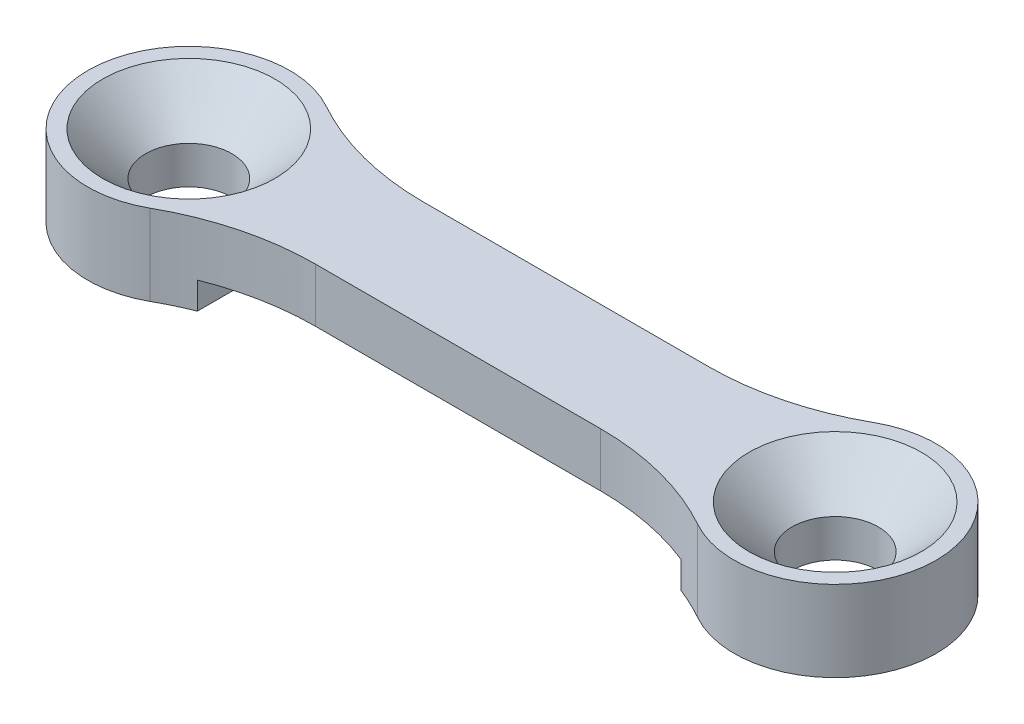
ISO-10303-21;
HEADER;
FILE_DESCRIPTION(('STEP AP214'),'2;1');
FILE_NAME('part.step','',(''),(''),'','','');
FILE_SCHEMA(('AUTOMOTIVE_DESIGN { 1 0 10303 214 1 1 1 1 }'));
ENDSEC;
DATA;
#1=APPLICATION_CONTEXT('core data for automotive mechanical design processes');
#2=APPLICATION_PROTOCOL_DEFINITION('international standard','automotive_design',2000,#1);
#3=PRODUCT_CONTEXT('',#1,'mechanical');
#4=PRODUCT('Part','Part','',(#3));
#5=PRODUCT_RELATED_PRODUCT_CATEGORY('part','',(#4));
#6=PRODUCT_DEFINITION_FORMATION('','',#4);
#7=PRODUCT_DEFINITION_CONTEXT('part definition',#1,'design');
#8=PRODUCT_DEFINITION('design','',#6,#7);
#9=PRODUCT_DEFINITION_SHAPE('','',#8);
#10=(LENGTH_UNIT() NAMED_UNIT(*) SI_UNIT(.MILLI.,.METRE.));
#11=(NAMED_UNIT(*) PLANE_ANGLE_UNIT() SI_UNIT($,.RADIAN.));
#12=(NAMED_UNIT(*) SI_UNIT($,.STERADIAN.) SOLID_ANGLE_UNIT());
#13=UNCERTAINTY_MEASURE_WITH_UNIT(LENGTH_MEASURE(1.E-05),#10,'distance_accuracy_value','');
#14=(GEOMETRIC_REPRESENTATION_CONTEXT(3) GLOBAL_UNCERTAINTY_ASSIGNED_CONTEXT((#13)) GLOBAL_UNIT_ASSIGNED_CONTEXT((#10,
#11,#12)) REPRESENTATION_CONTEXT('',''));
#15=CARTESIAN_POINT('',(0.,0.,0.));
#16=DIRECTION('',(0.,0.,1.));
#17=DIRECTION('',(1.,0.,0.));
#18=AXIS2_PLACEMENT_3D('',#15,#16,#17);
#19=CARTESIAN_POINT('',(0.,3.,2.00000000000001));
#20=DIRECTION('',(0.,0.,-1.));
#21=DIRECTION('',(-1.,0.,0.));
#22=AXIS2_PLACEMENT_3D('',#19,#20,#21);
#23=PLANE('',#22);
#24=DIRECTION('',(-1.,0.,0.));
#25=VECTOR('',#24,1.);
#26=CARTESIAN_POINT('',(0.,1.,2.00000000000001));
#27=LINE('',#26,#25);
#28=CARTESIAN_POINT('',(5.28713920895123,1.,2.));
#29=VERTEX_POINT('',#28);
#30=CARTESIAN_POINT('',(-5.28713920895124,1.,2.00000000000001));
#31=VERTEX_POINT('',#30);
#32=EDGE_CURVE('E66',#29,#31,#27,.T.);
#33=ORIENTED_EDGE('',*,*,#32,.F.);
#34=DIRECTION('',(0.,1.,0.));
#35=VECTOR('',#34,1.);
#36=CARTESIAN_POINT('',(5.28713920895123,3.,2.));
#37=LINE('',#36,#35);
#38=CARTESIAN_POINT('',(5.28713920895123,3.,2.));
#39=VERTEX_POINT('',#38);
#40=EDGE_CURVE('E236',#29,#39,#37,.T.);
#41=ORIENTED_EDGE('',*,*,#40,.T.);
#42=DIRECTION('',(1.,0.,0.));
#43=VECTOR('',#42,1.);
#44=CARTESIAN_POINT('',(0.,3.,2.00000000000001));
#45=LINE('',#44,#43);
#46=CARTESIAN_POINT('',(-5.28713920895124,3.,2.00000000000001));
#47=VERTEX_POINT('',#46);
#48=EDGE_CURVE('E183',#47,#39,#45,.T.);
#49=ORIENTED_EDGE('',*,*,#48,.F.);
#50=DIRECTION('',(0.,1.,0.));
#51=VECTOR('',#50,1.);
#52=CARTESIAN_POINT('',(-5.28713920895124,0.,2.00000000000001));
#53=LINE('',#52,#51);
#54=EDGE_CURVE('E232',#47,#31,#53,.F.);
#55=ORIENTED_EDGE('',*,*,#54,.T.);
#56=EDGE_LOOP('',(#33,#41,#49,#55));
#57=FACE_BOUND('',#56,.T.);
#58=ADVANCED_FACE('F51',(#57),#23,.F.);
#59=CARTESIAN_POINT('',(0.,3.,-2.));
#60=DIRECTION('',(0.,0.,-1.));
#61=DIRECTION('',(-1.,0.,0.));
#62=AXIS2_PLACEMENT_3D('',#59,#60,#61);
#63=PLANE('',#62);
#64=DIRECTION('',(0.,-1.,0.));
#65=VECTOR('',#64,1.);
#66=CARTESIAN_POINT('',(5.28713920895123,3.,-2.));
#67=LINE('',#66,#65);
#68=CARTESIAN_POINT('',(5.28713920895123,3.,-2.));
#69=VERTEX_POINT('',#68);
#70=CARTESIAN_POINT('',(5.28713920895123,1.,-2.));
#71=VERTEX_POINT('',#70);
#72=EDGE_CURVE('E241',#69,#71,#67,.T.);
#73=ORIENTED_EDGE('',*,*,#72,.T.);
#74=DIRECTION('',(-1.,0.,0.));
#75=VECTOR('',#74,1.);
#76=CARTESIAN_POINT('',(0.,1.,-2.));
#77=LINE('',#76,#75);
#78=CARTESIAN_POINT('',(-5.28713920895122,1.,-2.));
#79=VERTEX_POINT('',#78);
#80=EDGE_CURVE('E167',#71,#79,#77,.T.);
#81=ORIENTED_EDGE('',*,*,#80,.T.);
#82=DIRECTION('',(0.,-1.,0.));
#83=VECTOR('',#82,1.);
#84=CARTESIAN_POINT('',(-5.28713920895122,3.,-2.));
#85=LINE('',#84,#83);
#86=CARTESIAN_POINT('',(-5.28713920895122,3.,-2.));
#87=VERTEX_POINT('',#86);
#88=EDGE_CURVE('E165',#79,#87,#85,.F.);
#89=ORIENTED_EDGE('',*,*,#88,.T.);
#90=DIRECTION('',(1.,0.,0.));
#91=VECTOR('',#90,1.);
#92=CARTESIAN_POINT('',(0.,3.,-2.));
#93=LINE('',#92,#91);
#94=EDGE_CURVE('E192',#87,#69,#93,.T.);
#95=ORIENTED_EDGE('',*,*,#94,.T.);
#96=EDGE_LOOP('',(#73,#81,#89,#95));
#97=FACE_BOUND('',#96,.T.);
#98=ADVANCED_FACE('F325',(#97),#63,.T.);
#99=CARTESIAN_POINT('',(0.,0.,0.));
#100=DIRECTION('',(0.,1.,0.));
#101=DIRECTION('',(0.,0.,1.));
#102=AXIS2_PLACEMENT_3D('',#99,#100,#101);
#103=PLANE('',#102);
#104=CARTESIAN_POINT('',(-12.,0.,0.));
#105=DIRECTION('',(0.,1.,0.));
#106=DIRECTION('',(0.,0.,1.));
#107=AXIS2_PLACEMENT_3D('',#104,#105,#106);
#108=CIRCLE('',#107,1.6);
#109=CARTESIAN_POINT('',(-12.,0.,1.6));
#110=VERTEX_POINT('',#109);
#111=EDGE_CURVE('E179',#110,#110,#108,.T.);
#112=ORIENTED_EDGE('',*,*,#111,.T.);
#113=EDGE_LOOP('',(#112));
#114=FACE_BOUND('',#113,.T.);
#115=CARTESIAN_POINT('',(-5.28713920895122,0.,-12.));
#116=DIRECTION('',(0.,1.,0.));
#117=DIRECTION('',(0.,0.,1.));
#118=AXIS2_PLACEMENT_3D('',#115,#116,#117);
#119=CIRCLE('',#118,10.);
#120=CARTESIAN_POINT('',(-10.1692197842594,0.,-3.27272727272727));
#121=VERTEX_POINT('',#120);
#122=CARTESIAN_POINT('',(-8.975,0.,-2.70485703252257));
#123=VERTEX_POINT('',#122);
#124=EDGE_CURVE('E264',#121,#123,#119,.T.);
#125=ORIENTED_EDGE('',*,*,#124,.T.);
#126=DIRECTION('',(0.,0.,-1.));
#127=VECTOR('',#126,1.);
#128=CARTESIAN_POINT('',(-8.975,0.,-2.70485703252257));
#129=LINE('',#128,#127);
#130=CARTESIAN_POINT('',(-8.975,0.,2.70485703252257));
#131=VERTEX_POINT('',#130);
#132=EDGE_CURVE('E148',#131,#123,#129,.T.);
#133=ORIENTED_EDGE('',*,*,#132,.F.);
#134=CARTESIAN_POINT('',(-5.28713920895124,0.,12.));
#135=DIRECTION('',(0.,1.,0.));
#136=DIRECTION('',(0.,0.,1.));
#137=AXIS2_PLACEMENT_3D('',#134,#135,#136);
#138=CIRCLE('',#137,10.);
#139=CARTESIAN_POINT('',(-10.1692197842594,0.,3.27272727272727));
#140=VERTEX_POINT('',#139);
#141=EDGE_CURVE('E270',#131,#140,#138,.T.);
#142=ORIENTED_EDGE('',*,*,#141,.T.);
#143=CARTESIAN_POINT('',(-12.,0.,0.));
#144=DIRECTION('',(0.,1.,0.));
#145=DIRECTION('',(0.,0.,1.));
#146=AXIS2_PLACEMENT_3D('',#143,#144,#145);
#147=CIRCLE('',#146,3.75);
#148=EDGE_CURVE('E200',#121,#140,#147,.T.);
#149=ORIENTED_EDGE('',*,*,#148,.F.);
#150=EDGE_LOOP('',(#125,#133,#142,#149));
#151=FACE_BOUND('',#150,.T.);
#152=ADVANCED_FACE('F330',(#114,#151),#103,.F.);
#153=CARTESIAN_POINT('',(-12.,3.,0.));
#154=DIRECTION('',(0.,-1.,0.));
#155=DIRECTION('',(0.,0.,-1.));
#156=AXIS2_PLACEMENT_3D('',#153,#154,#155);
#157=CYLINDRICAL_SURFACE('',#156,3.75);
#158=CARTESIAN_POINT('',(-12.,3.,0.));
#159=DIRECTION('',(0.,1.,0.));
#160=DIRECTION('',(0.,0.,1.));
#161=AXIS2_PLACEMENT_3D('',#158,#159,#160);
#162=CIRCLE('',#161,3.75);
#163=CARTESIAN_POINT('',(-10.1692197842594,3.,-3.27272727272727));
#164=VERTEX_POINT('',#163);
#165=CARTESIAN_POINT('',(-10.1692197842594,3.,3.27272727272727));
#166=VERTEX_POINT('',#165);
#167=EDGE_CURVE('E180',#164,#166,#162,.T.);
#168=ORIENTED_EDGE('',*,*,#167,.F.);
#169=DIRECTION('',(0.,-1.,0.));
#170=VECTOR('',#169,1.);
#171=CARTESIAN_POINT('',(-10.1692197842594,3.,-3.27272727272727));
#172=LINE('',#171,#170);
#173=EDGE_CURVE('E247',#164,#121,#172,.T.);
#174=ORIENTED_EDGE('',*,*,#173,.T.);
#175=ORIENTED_EDGE('',*,*,#148,.T.);
#176=DIRECTION('',(0.,-1.,0.));
#177=VECTOR('',#176,1.);
#178=CARTESIAN_POINT('',(-10.1692197842594,3.,3.27272727272727));
#179=LINE('',#178,#177);
#180=EDGE_CURVE('E74',#140,#166,#179,.F.);
#181=ORIENTED_EDGE('',*,*,#180,.T.);
#182=EDGE_LOOP('',(#168,#174,#175,#181));
#183=FACE_BOUND('',#182,.T.);
#184=ADVANCED_FACE('F328',(#183),#157,.T.);
#185=CARTESIAN_POINT('',(12.,3.,0.));
#186=DIRECTION('',(0.,-1.,0.));
#187=DIRECTION('',(0.,0.,-1.));
#188=AXIS2_PLACEMENT_3D('',#185,#186,#187);
#189=CYLINDRICAL_SURFACE('',#188,3.75);
#190=CARTESIAN_POINT('',(12.,3.,0.));
#191=DIRECTION('',(0.,1.,0.));
#192=DIRECTION('',(0.,0.,1.));
#193=AXIS2_PLACEMENT_3D('',#190,#191,#192);
#194=CIRCLE('',#193,3.75);
#195=CARTESIAN_POINT('',(10.1692197842594,3.,3.27272727272727));
#196=VERTEX_POINT('',#195);
#197=CARTESIAN_POINT('',(10.1692197842594,3.,-3.27272727272727));
#198=VERTEX_POINT('',#197);
#199=EDGE_CURVE('E188',#196,#198,#194,.T.);
#200=ORIENTED_EDGE('',*,*,#199,.F.);
#201=DIRECTION('',(0.,-1.,0.));
#202=VECTOR('',#201,1.);
#203=CARTESIAN_POINT('',(10.1692197842594,3.,3.27272727272727));
#204=LINE('',#203,#202);
#205=CARTESIAN_POINT('',(10.1692197842594,0.,3.27272727272727));
#206=VERTEX_POINT('',#205);
#207=EDGE_CURVE('E228',#196,#206,#204,.T.);
#208=ORIENTED_EDGE('',*,*,#207,.T.);
#209=CARTESIAN_POINT('',(12.,0.,0.));
#210=DIRECTION('',(0.,1.,0.));
#211=DIRECTION('',(0.,0.,1.));
#212=AXIS2_PLACEMENT_3D('',#209,#210,#211);
#213=CIRCLE('',#212,3.75);
#214=CARTESIAN_POINT('',(10.1692197842594,0.,-3.27272727272727));
#215=VERTEX_POINT('',#214);
#216=EDGE_CURVE('E203',#206,#215,#213,.T.);
#217=ORIENTED_EDGE('',*,*,#216,.T.);
#218=DIRECTION('',(0.,-1.,0.));
#219=VECTOR('',#218,1.);
#220=CARTESIAN_POINT('',(10.1692197842594,3.,-3.27272727272727));
#221=LINE('',#220,#219);
#222=EDGE_CURVE('E225',#215,#198,#221,.F.);
#223=ORIENTED_EDGE('',*,*,#222,.T.);
#224=EDGE_LOOP('',(#200,#208,#217,#223));
#225=FACE_BOUND('',#224,.T.);
#226=ADVANCED_FACE('F316',(#225),#189,.T.);
#227=CARTESIAN_POINT('',(-12.,3.,0.));
#228=DIRECTION('',(0.,-1.,0.));
#229=DIRECTION('',(0.,0.,-1.));
#230=AXIS2_PLACEMENT_3D('',#227,#228,#229);
#231=CYLINDRICAL_SURFACE('',#230,1.6);
#232=CARTESIAN_POINT('',(-12.,1.4,0.));
#233=DIRECTION('',(0.,1.,0.));
#234=DIRECTION('',(0.,0.,1.));
#235=AXIS2_PLACEMENT_3D('',#232,#233,#234);
#236=CIRCLE('',#235,1.6);
#237=CARTESIAN_POINT('',(-12.,1.4,1.6));
#238=VERTEX_POINT('',#237);
#239=EDGE_CURVE('E221',#238,#238,#236,.T.);
#240=ORIENTED_EDGE('',*,*,#239,.T.);
#241=EDGE_LOOP('',(#240));
#242=FACE_BOUND('',#241,.T.);
#243=ORIENTED_EDGE('',*,*,#111,.F.);
#244=EDGE_LOOP('',(#243));
#245=FACE_BOUND('',#244,.T.);
#246=ADVANCED_FACE('F351',(#242,#245),#231,.F.);
#247=CARTESIAN_POINT('',(12.,3.,0.));
#248=DIRECTION('',(0.,-1.,0.));
#249=DIRECTION('',(0.,0.,-1.));
#250=AXIS2_PLACEMENT_3D('',#247,#248,#249);
#251=CYLINDRICAL_SURFACE('',#250,1.6);
#252=CARTESIAN_POINT('',(12.,1.4,0.));
#253=DIRECTION('',(0.,1.,0.));
#254=DIRECTION('',(0.,0.,1.));
#255=AXIS2_PLACEMENT_3D('',#252,#253,#254);
#256=CIRCLE('',#255,1.6);
#257=CARTESIAN_POINT('',(12.,1.4,1.6));
#258=VERTEX_POINT('',#257);
#259=EDGE_CURVE('E196',#258,#258,#256,.T.);
#260=ORIENTED_EDGE('',*,*,#259,.T.);
#261=EDGE_LOOP('',(#260));
#262=FACE_BOUND('',#261,.T.);
#263=CARTESIAN_POINT('',(12.,0.,0.));
#264=DIRECTION('',(0.,1.,0.));
#265=DIRECTION('',(0.,0.,1.));
#266=AXIS2_PLACEMENT_3D('',#263,#264,#265);
#267=CIRCLE('',#266,1.6);
#268=CARTESIAN_POINT('',(12.,0.,1.6));
#269=VERTEX_POINT('',#268);
#270=EDGE_CURVE('E184',#269,#269,#267,.T.);
#271=ORIENTED_EDGE('',*,*,#270,.F.);
#272=EDGE_LOOP('',(#271));
#273=FACE_BOUND('',#272,.T.);
#274=ADVANCED_FACE('F354',(#262,#273),#251,.F.);
#275=CARTESIAN_POINT('',(0.,3.,0.));
#276=DIRECTION('',(0.,1.,0.));
#277=DIRECTION('',(0.,0.,1.));
#278=AXIS2_PLACEMENT_3D('',#275,#276,#277);
#279=PLANE('',#278);
#280=CARTESIAN_POINT('',(12.,3.,0.));
#281=DIRECTION('',(0.,1.,0.));
#282=DIRECTION('',(0.,0.,1.));
#283=AXIS2_PLACEMENT_3D('',#280,#281,#282);
#284=CIRCLE('',#283,3.20000000000001);
#285=CARTESIAN_POINT('',(12.,3.,3.20000000000001));
#286=VERTEX_POINT('',#285);
#287=EDGE_CURVE('E217',#286,#286,#284,.F.);
#288=ORIENTED_EDGE('',*,*,#287,.T.);
#289=EDGE_LOOP('',(#288));
#290=FACE_BOUND('',#289,.T.);
#291=CARTESIAN_POINT('',(-12.,3.,0.));
#292=DIRECTION('',(0.,1.,0.));
#293=DIRECTION('',(0.,0.,1.));
#294=AXIS2_PLACEMENT_3D('',#291,#292,#293);
#295=CIRCLE('',#294,3.20000000000001);
#296=CARTESIAN_POINT('',(-12.,3.,3.20000000000001));
#297=VERTEX_POINT('',#296);
#298=EDGE_CURVE('E213',#297,#297,#295,.F.);
#299=ORIENTED_EDGE('',*,*,#298,.T.);
#300=EDGE_LOOP('',(#299));
#301=FACE_BOUND('',#300,.T.);
#302=ORIENTED_EDGE('',*,*,#94,.F.);
#303=CARTESIAN_POINT('',(-5.28713920895122,3.,-12.));
#304=DIRECTION('',(0.,1.,0.));
#305=DIRECTION('',(0.,0.,1.));
#306=AXIS2_PLACEMENT_3D('',#303,#304,#305);
#307=CIRCLE('',#306,10.);
#308=EDGE_CURVE('E267',#87,#164,#307,.F.);
#309=ORIENTED_EDGE('',*,*,#308,.T.);
#310=ORIENTED_EDGE('',*,*,#167,.T.);
#311=CARTESIAN_POINT('',(-5.28713920895124,3.,12.));
#312=DIRECTION('',(0.,1.,0.));
#313=DIRECTION('',(0.,0.,1.));
#314=AXIS2_PLACEMENT_3D('',#311,#312,#313);
#315=CIRCLE('',#314,10.);
#316=EDGE_CURVE('E60',#166,#47,#315,.F.);
#317=ORIENTED_EDGE('',*,*,#316,.T.);
#318=ORIENTED_EDGE('',*,*,#48,.T.);
#319=CARTESIAN_POINT('',(5.28713920895123,3.,12.));
#320=DIRECTION('',(0.,1.,0.));
#321=DIRECTION('',(0.,0.,1.));
#322=AXIS2_PLACEMENT_3D('',#319,#320,#321);
#323=CIRCLE('',#322,10.);
#324=EDGE_CURVE('E255',#39,#196,#323,.F.);
#325=ORIENTED_EDGE('',*,*,#324,.T.);
#326=ORIENTED_EDGE('',*,*,#199,.T.);
#327=CARTESIAN_POINT('',(5.28713920895123,3.,-12.));
#328=DIRECTION('',(0.,1.,0.));
#329=DIRECTION('',(0.,0.,1.));
#330=AXIS2_PLACEMENT_3D('',#327,#328,#329);
#331=CIRCLE('',#330,10.);
#332=EDGE_CURVE('E261',#198,#69,#331,.F.);
#333=ORIENTED_EDGE('',*,*,#332,.T.);
#334=EDGE_LOOP('',(#302,#309,#310,#317,#318,#325,#326,#333));
#335=FACE_BOUND('',#334,.T.);
#336=ADVANCED_FACE('F277',(#290,#301,#335),#279,.T.);
#337=CARTESIAN_POINT('',(5.28713920895123,0.,12.));
#338=DIRECTION('',(0.,1.,0.));
#339=DIRECTION('',(0.,0.,1.));
#340=AXIS2_PLACEMENT_3D('',#337,#338,#339);
#341=CIRCLE('',#340,10.);
#342=CARTESIAN_POINT('',(8.975,0.,2.70485703252257));
#343=VERTEX_POINT('',#342);
#344=EDGE_CURVE('E251',#206,#343,#341,.T.);
#345=ORIENTED_EDGE('',*,*,#344,.T.);
#346=DIRECTION('',(0.,0.,1.));
#347=VECTOR('',#346,1.);
#348=CARTESIAN_POINT('',(8.975,0.,-2.70485703252257));
#349=LINE('',#348,#347);
#350=CARTESIAN_POINT('',(8.975,0.,-2.70485703252257));
#351=VERTEX_POINT('',#350);
#352=EDGE_CURVE('E160',#351,#343,#349,.T.);
#353=ORIENTED_EDGE('',*,*,#352,.F.);
#354=CARTESIAN_POINT('',(5.28713920895123,0.,-12.));
#355=DIRECTION('',(0.,1.,0.));
#356=DIRECTION('',(0.,0.,1.));
#357=AXIS2_PLACEMENT_3D('',#354,#355,#356);
#358=CIRCLE('',#357,10.);
#359=EDGE_CURVE('E258',#351,#215,#358,.T.);
#360=ORIENTED_EDGE('',*,*,#359,.T.);
#361=ORIENTED_EDGE('',*,*,#216,.F.);
#362=EDGE_LOOP('',(#345,#353,#360,#361));
#363=FACE_BOUND('',#362,.T.);
#364=ORIENTED_EDGE('',*,*,#270,.T.);
#365=EDGE_LOOP('',(#364));
#366=FACE_BOUND('',#365,.T.);
#367=ADVANCED_FACE('F306',(#363,#366),#103,.F.);
#368=CARTESIAN_POINT('',(12.,1.4,0.));
#369=DIRECTION('',(0.,1.,0.));
#370=DIRECTION('',(0.,0.,1.));
#371=AXIS2_PLACEMENT_3D('',#368,#369,#370);
#372=CONICAL_SURFACE('',#371,1.6,0.78539816339745);
#373=ORIENTED_EDGE('',*,*,#287,.F.);
#374=EDGE_LOOP('',(#373));
#375=FACE_BOUND('',#374,.T.);
#376=ORIENTED_EDGE('',*,*,#259,.F.);
#377=EDGE_LOOP('',(#376));
#378=FACE_BOUND('',#377,.T.);
#379=ADVANCED_FACE('F343',(#375,#378),#372,.F.);
#380=CARTESIAN_POINT('',(-12.,1.4,0.));
#381=DIRECTION('',(0.,1.,0.));
#382=DIRECTION('',(0.,0.,1.));
#383=AXIS2_PLACEMENT_3D('',#380,#381,#382);
#384=CONICAL_SURFACE('',#383,1.6,0.78539816339745);
#385=ORIENTED_EDGE('',*,*,#298,.F.);
#386=EDGE_LOOP('',(#385));
#387=FACE_BOUND('',#386,.T.);
#388=ORIENTED_EDGE('',*,*,#239,.F.);
#389=EDGE_LOOP('',(#388));
#390=FACE_BOUND('',#389,.T.);
#391=ADVANCED_FACE('F362',(#387,#390),#384,.F.);
#392=CARTESIAN_POINT('',(5.28713920895123,3.,12.));
#393=DIRECTION('',(0.,-1.,0.));
#394=DIRECTION('',(0.,0.,-1.));
#395=AXIS2_PLACEMENT_3D('',#392,#393,#394);
#396=CYLINDRICAL_SURFACE('',#395,10.);
#397=CARTESIAN_POINT('',(5.28713920895123,1.,12.));
#398=DIRECTION('',(0.,-1.,0.));
#399=DIRECTION('',(0.,0.,-1.));
#400=AXIS2_PLACEMENT_3D('',#397,#398,#399);
#401=CIRCLE('',#400,10.);
#402=CARTESIAN_POINT('',(8.975,1.,2.70485703252257));
#403=VERTEX_POINT('',#402);
#404=EDGE_CURVE('E168',#403,#29,#401,.F.);
#405=ORIENTED_EDGE('',*,*,#404,.F.);
#406=DIRECTION('',(0.,-1.,0.));
#407=VECTOR('',#406,1.);
#408=CARTESIAN_POINT('',(8.975,1.,2.70485703252257));
#409=LINE('',#408,#407);
#410=EDGE_CURVE('E286',#403,#343,#409,.T.);
#411=ORIENTED_EDGE('',*,*,#410,.T.);
#412=ORIENTED_EDGE('',*,*,#344,.F.);
#413=ORIENTED_EDGE('',*,*,#207,.F.);
#414=ORIENTED_EDGE('',*,*,#324,.F.);
#415=ORIENTED_EDGE('',*,*,#40,.F.);
#416=EDGE_LOOP('',(#405,#411,#412,#413,#414,#415));
#417=FACE_BOUND('',#416,.T.);
#418=ADVANCED_FACE('F320',(#417),#396,.F.);
#419=CARTESIAN_POINT('',(5.28713920895123,3.,-12.));
#420=DIRECTION('',(0.,-1.,0.));
#421=DIRECTION('',(0.,0.,-1.));
#422=AXIS2_PLACEMENT_3D('',#419,#420,#421);
#423=CYLINDRICAL_SURFACE('',#422,10.);
#424=ORIENTED_EDGE('',*,*,#359,.F.);
#425=DIRECTION('',(0.,-1.,0.));
#426=VECTOR('',#425,1.);
#427=CARTESIAN_POINT('',(8.975,1.,-2.70485703252257));
#428=LINE('',#427,#426);
#429=CARTESIAN_POINT('',(8.975,1.,-2.70485703252257));
#430=VERTEX_POINT('',#429);
#431=EDGE_CURVE('E153',#430,#351,#428,.T.);
#432=ORIENTED_EDGE('',*,*,#431,.F.);
#433=CARTESIAN_POINT('',(5.28713920895123,1.,-12.));
#434=DIRECTION('',(0.,-1.,0.));
#435=DIRECTION('',(0.,0.,-1.));
#436=AXIS2_PLACEMENT_3D('',#433,#434,#435);
#437=CIRCLE('',#436,10.);
#438=EDGE_CURVE('E172',#71,#430,#437,.F.);
#439=ORIENTED_EDGE('',*,*,#438,.F.);
#440=ORIENTED_EDGE('',*,*,#72,.F.);
#441=ORIENTED_EDGE('',*,*,#332,.F.);
#442=ORIENTED_EDGE('',*,*,#222,.F.);
#443=EDGE_LOOP('',(#424,#432,#439,#440,#441,#442));
#444=FACE_BOUND('',#443,.T.);
#445=ADVANCED_FACE('F311',(#444),#423,.F.);
#446=CARTESIAN_POINT('',(-5.28713920895122,3.,-12.));
#447=DIRECTION('',(0.,-1.,0.));
#448=DIRECTION('',(0.,0.,-1.));
#449=AXIS2_PLACEMENT_3D('',#446,#447,#448);
#450=CYLINDRICAL_SURFACE('',#449,10.);
#451=CARTESIAN_POINT('',(-5.28713920895122,1.,-12.));
#452=DIRECTION('',(0.,-1.,0.));
#453=DIRECTION('',(0.,0.,-1.));
#454=AXIS2_PLACEMENT_3D('',#451,#452,#453);
#455=CIRCLE('',#454,10.);
#456=CARTESIAN_POINT('',(-8.975,1.,-2.70485703252257));
#457=VERTEX_POINT('',#456);
#458=EDGE_CURVE('E157',#457,#79,#455,.F.);
#459=ORIENTED_EDGE('',*,*,#458,.F.);
#460=DIRECTION('',(0.,-1.,0.));
#461=VECTOR('',#460,1.);
#462=CARTESIAN_POINT('',(-8.975,1.,-2.70485703252257));
#463=LINE('',#462,#461);
#464=EDGE_CURVE('E142',#457,#123,#463,.T.);
#465=ORIENTED_EDGE('',*,*,#464,.T.);
#466=ORIENTED_EDGE('',*,*,#124,.F.);
#467=ORIENTED_EDGE('',*,*,#173,.F.);
#468=ORIENTED_EDGE('',*,*,#308,.F.);
#469=ORIENTED_EDGE('',*,*,#88,.F.);
#470=EDGE_LOOP('',(#459,#465,#466,#467,#468,#469));
#471=FACE_BOUND('',#470,.T.);
#472=ADVANCED_FACE('F163',(#471),#450,.F.);
#473=CARTESIAN_POINT('',(-5.28713920895124,3.,12.));
#474=DIRECTION('',(0.,-1.,0.));
#475=DIRECTION('',(0.,0.,-1.));
#476=AXIS2_PLACEMENT_3D('',#473,#474,#475);
#477=CYLINDRICAL_SURFACE('',#476,10.);
#478=ORIENTED_EDGE('',*,*,#141,.F.);
#479=DIRECTION('',(0.,-1.,0.));
#480=VECTOR('',#479,1.);
#481=CARTESIAN_POINT('',(-8.975,1.,2.70485703252257));
#482=LINE('',#481,#480);
#483=CARTESIAN_POINT('',(-8.975,1.,2.70485703252257));
#484=VERTEX_POINT('',#483);
#485=EDGE_CURVE('E284',#484,#131,#482,.T.);
#486=ORIENTED_EDGE('',*,*,#485,.F.);
#487=CARTESIAN_POINT('',(-5.28713920895124,1.,12.));
#488=DIRECTION('',(0.,-1.,0.));
#489=DIRECTION('',(0.,0.,-1.));
#490=AXIS2_PLACEMENT_3D('',#487,#488,#489);
#491=CIRCLE('',#490,10.);
#492=EDGE_CURVE('E11',#31,#484,#491,.F.);
#493=ORIENTED_EDGE('',*,*,#492,.F.);
#494=ORIENTED_EDGE('',*,*,#54,.F.);
#495=ORIENTED_EDGE('',*,*,#316,.F.);
#496=ORIENTED_EDGE('',*,*,#180,.F.);
#497=EDGE_LOOP('',(#478,#486,#493,#494,#495,#496));
#498=FACE_BOUND('',#497,.T.);
#499=ADVANCED_FACE('F53',(#498),#477,.F.);
#500=CARTESIAN_POINT('',(0.,1.,0.));
#501=DIRECTION('',(0.,-1.,0.));
#502=DIRECTION('',(0.,0.,-1.));
#503=AXIS2_PLACEMENT_3D('',#500,#501,#502);
#504=PLANE('',#503);
#505=ORIENTED_EDGE('',*,*,#438,.T.);
#506=DIRECTION('',(0.,0.,1.));
#507=VECTOR('',#506,1.);
#508=CARTESIAN_POINT('',(8.975,1.,-2.70485703252257));
#509=LINE('',#508,#507);
#510=EDGE_CURVE('E154',#430,#403,#509,.T.);
#511=ORIENTED_EDGE('',*,*,#510,.T.);
#512=ORIENTED_EDGE('',*,*,#404,.T.);
#513=ORIENTED_EDGE('',*,*,#32,.T.);
#514=ORIENTED_EDGE('',*,*,#492,.T.);
#515=DIRECTION('',(0.,0.,-1.));
#516=VECTOR('',#515,1.);
#517=CARTESIAN_POINT('',(-8.975,1.,-2.70485703252257));
#518=LINE('',#517,#516);
#519=EDGE_CURVE('E145',#484,#457,#518,.T.);
#520=ORIENTED_EDGE('',*,*,#519,.T.);
#521=ORIENTED_EDGE('',*,*,#458,.T.);
#522=ORIENTED_EDGE('',*,*,#80,.F.);
#523=EDGE_LOOP('',(#505,#511,#512,#513,#514,#520,#521,#522));
#524=FACE_BOUND('',#523,.T.);
#525=ADVANCED_FACE('F156',(#524),#504,.T.);
#526=CARTESIAN_POINT('',(-8.975,1.,-2.70485703252257));
#527=DIRECTION('',(-1.,0.,0.));
#528=DIRECTION('',(0.,0.,1.));
#529=AXIS2_PLACEMENT_3D('',#526,#527,#528);
#530=PLANE('',#529);
#531=ORIENTED_EDGE('',*,*,#132,.T.);
#532=ORIENTED_EDGE('',*,*,#464,.F.);
#533=ORIENTED_EDGE('',*,*,#519,.F.);
#534=ORIENTED_EDGE('',*,*,#485,.T.);
#535=EDGE_LOOP('',(#531,#532,#533,#534));
#536=FACE_BOUND('',#535,.T.);
#537=ADVANCED_FACE('F144',(#536),#530,.F.);
#538=CARTESIAN_POINT('',(8.975,1.,-2.70485703252257));
#539=DIRECTION('',(1.,0.,0.));
#540=DIRECTION('',(0.,0.,-1.));
#541=AXIS2_PLACEMENT_3D('',#538,#539,#540);
#542=PLANE('',#541);
#543=ORIENTED_EDGE('',*,*,#352,.T.);
#544=ORIENTED_EDGE('',*,*,#410,.F.);
#545=ORIENTED_EDGE('',*,*,#510,.F.);
#546=ORIENTED_EDGE('',*,*,#431,.T.);
#547=EDGE_LOOP('',(#543,#544,#545,#546));
#548=FACE_BOUND('',#547,.T.);
#549=ADVANCED_FACE('F300',(#548),#542,.F.);
#550=CLOSED_SHELL('',(#58,#98,#152,#184,#226,#246,#274,#336,#367,#379,#391,#418,#445,#472,#499,
#525,#537,#549));
#551=MANIFOLD_SOLID_BREP('B2',#550);
#552=ADVANCED_BREP_SHAPE_REPRESENTATION('',(#18,#551),#14);
#553=SHAPE_DEFINITION_REPRESENTATION(#9,#552);
ENDSEC;
END-ISO-10303-21;
